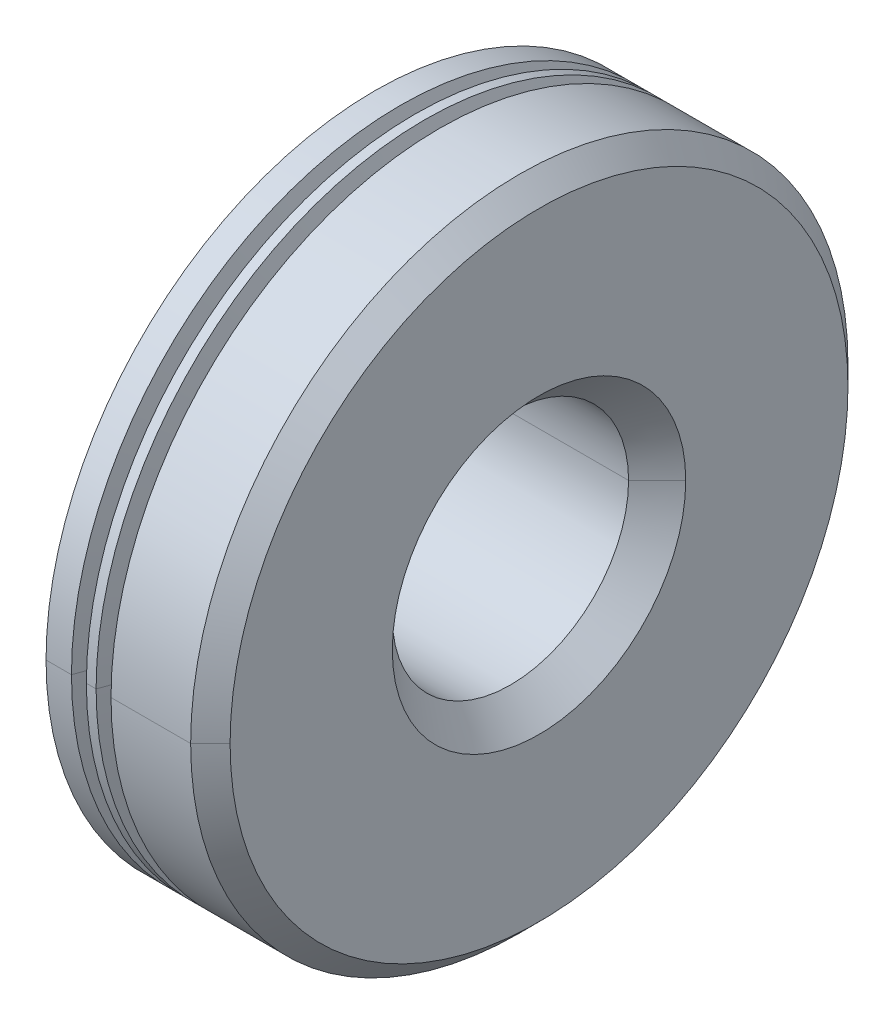
ISO-10303-21;
HEADER;
FILE_DESCRIPTION(('STEP AP214'),'2;1');
FILE_NAME('part.step','',(''),(''),'','','');
FILE_SCHEMA(('AUTOMOTIVE_DESIGN { 1 0 10303 214 1 1 1 1 }'));
ENDSEC;
DATA;
#1=APPLICATION_CONTEXT('core data for automotive mechanical design processes');
#2=APPLICATION_PROTOCOL_DEFINITION('international standard','automotive_design',2000,#1);
#3=PRODUCT_CONTEXT('',#1,'mechanical');
#4=PRODUCT('Part','Part','',(#3));
#5=PRODUCT_RELATED_PRODUCT_CATEGORY('part','',(#4));
#6=PRODUCT_DEFINITION_FORMATION('','',#4);
#7=PRODUCT_DEFINITION_CONTEXT('part definition',#1,'design');
#8=PRODUCT_DEFINITION('design','',#6,#7);
#9=PRODUCT_DEFINITION_SHAPE('','',#8);
#10=(LENGTH_UNIT() NAMED_UNIT(*) SI_UNIT(.MILLI.,.METRE.));
#11=(NAMED_UNIT(*) PLANE_ANGLE_UNIT() SI_UNIT($,.RADIAN.));
#12=(NAMED_UNIT(*) SI_UNIT($,.STERADIAN.) SOLID_ANGLE_UNIT());
#13=UNCERTAINTY_MEASURE_WITH_UNIT(LENGTH_MEASURE(1.E-05),#10,'distance_accuracy_value','');
#14=(GEOMETRIC_REPRESENTATION_CONTEXT(3) GLOBAL_UNCERTAINTY_ASSIGNED_CONTEXT((#13)) GLOBAL_UNIT_ASSIGNED_CONTEXT((#10,
#11,#12)) REPRESENTATION_CONTEXT('',''));
#15=CARTESIAN_POINT('',(0.,0.,0.));
#16=DIRECTION('',(0.,0.,1.));
#17=DIRECTION('',(1.,0.,0.));
#18=AXIS2_PLACEMENT_3D('',#15,#16,#17);
#19=CARTESIAN_POINT('',(1.926,0.,0.));
#20=DIRECTION('',(-1.,0.,0.));
#21=DIRECTION('',(0.,0.,1.));
#22=AXIS2_PLACEMENT_3D('',#19,#20,#21);
#23=CONICAL_SURFACE('',#22,2.716,0.785398163397449);
#24=DIRECTION('',(0.707106781186547,0.,-0.707106781186548));
#25=VECTOR('',#24,1.);
#26=CARTESIAN_POINT('',(1.926,-1.02920078459353E-13,2.716));
#27=LINE('',#26,#25);
#28=CARTESIAN_POINT('',(1.842,0.,2.8));
#29=VERTEX_POINT('',#28);
#30=CARTESIAN_POINT('',(2.01,0.,2.632));
#31=VERTEX_POINT('',#30);
#32=EDGE_CURVE('E27',#29,#31,#27,.T.);
#33=ORIENTED_EDGE('',*,*,#32,.F.);
#34=CARTESIAN_POINT('',(1.842,0.,0.));
#35=DIRECTION('',(1.,0.,0.));
#36=DIRECTION('',(0.,0.,1.));
#37=AXIS2_PLACEMENT_3D('',#34,#35,#36);
#38=CIRCLE('',#37,2.8);
#39=CARTESIAN_POINT('',(1.842,1.06103173669436E-13,-2.8));
#40=VERTEX_POINT('',#39);
#41=EDGE_CURVE('E338',#29,#40,#38,.T.);
#42=ORIENTED_EDGE('',*,*,#41,.T.);
#43=DIRECTION('',(-0.707106781186547,0.,-0.707106781186548));
#44=VECTOR('',#43,1.);
#45=CARTESIAN_POINT('',(1.926,1.02920078459353E-13,-2.716));
#46=LINE('',#45,#44);
#47=CARTESIAN_POINT('',(2.01,0.,-2.632));
#48=VERTEX_POINT('',#47);
#49=EDGE_CURVE('E10',#48,#40,#46,.T.);
#50=ORIENTED_EDGE('',*,*,#49,.F.);
#51=CARTESIAN_POINT('',(2.01,0.,0.));
#52=DIRECTION('',(1.,0.,0.));
#53=DIRECTION('',(0.,0.,1.));
#54=AXIS2_PLACEMENT_3D('',#51,#52,#53);
#55=CIRCLE('',#54,2.632);
#56=EDGE_CURVE('E294',#31,#48,#55,.T.);
#57=ORIENTED_EDGE('',*,*,#56,.F.);
#58=EDGE_LOOP('',(#33,#42,#50,#57));
#59=FACE_BOUND('',#58,.T.);
#60=ADVANCED_FACE('F16',(#59),#23,.T.);
#61=CARTESIAN_POINT('',(1.926,0.,0.));
#62=DIRECTION('',(-1.,0.,0.));
#63=DIRECTION('',(0.,0.,1.));
#64=AXIS2_PLACEMENT_3D('',#61,#62,#63);
#65=CONICAL_SURFACE('',#64,2.716,0.785398163397449);
#66=ORIENTED_EDGE('',*,*,#32,.T.);
#67=CARTESIAN_POINT('',(2.01,0.,0.));
#68=DIRECTION('',(1.,0.,0.));
#69=DIRECTION('',(0.,0.,1.));
#70=AXIS2_PLACEMENT_3D('',#67,#68,#69);
#71=CIRCLE('',#70,2.632);
#72=EDGE_CURVE('E341',#48,#31,#71,.T.);
#73=ORIENTED_EDGE('',*,*,#72,.F.);
#74=ORIENTED_EDGE('',*,*,#49,.T.);
#75=CARTESIAN_POINT('',(1.842,0.,0.));
#76=DIRECTION('',(1.,0.,0.));
#77=DIRECTION('',(0.,0.,1.));
#78=AXIS2_PLACEMENT_3D('',#75,#76,#77);
#79=CIRCLE('',#78,2.8);
#80=EDGE_CURVE('E253',#40,#29,#79,.T.);
#81=ORIENTED_EDGE('',*,*,#80,.T.);
#82=EDGE_LOOP('',(#66,#73,#74,#81));
#83=FACE_BOUND('',#82,.T.);
#84=ADVANCED_FACE('F521',(#83),#65,.T.);
#85=CARTESIAN_POINT('',(1.226,0.,0.));
#86=DIRECTION('',(1.,0.,0.));
#87=DIRECTION('',(0.,0.,1.));
#88=AXIS2_PLACEMENT_3D('',#85,#86,#87);
#89=CYLINDRICAL_SURFACE('',#88,2.8);
#90=DIRECTION('',(1.,0.,0.));
#91=VECTOR('',#90,1.);
#92=CARTESIAN_POINT('',(1.226,-1.06103173669436E-13,2.8));
#93=LINE('',#92,#91);
#94=CARTESIAN_POINT('',(1.1635,0.,2.8));
#95=VERTEX_POINT('',#94);
#96=EDGE_CURVE('E257',#95,#29,#93,.T.);
#97=ORIENTED_EDGE('',*,*,#96,.F.);
#98=CARTESIAN_POINT('',(1.1635,0.,0.));
#99=DIRECTION('',(1.,0.,0.));
#100=DIRECTION('',(0.,0.,1.));
#101=AXIS2_PLACEMENT_3D('',#98,#99,#100);
#102=CIRCLE('',#101,2.8);
#103=CARTESIAN_POINT('',(1.1635,0.,-2.8));
#104=VERTEX_POINT('',#103);
#105=EDGE_CURVE('E240',#95,#104,#102,.T.);
#106=ORIENTED_EDGE('',*,*,#105,.T.);
#107=DIRECTION('',(-1.,0.,0.));
#108=VECTOR('',#107,1.);
#109=CARTESIAN_POINT('',(1.226,1.06103173669436E-13,-2.8));
#110=LINE('',#109,#108);
#111=EDGE_CURVE('E256',#40,#104,#110,.T.);
#112=ORIENTED_EDGE('',*,*,#111,.F.);
#113=ORIENTED_EDGE('',*,*,#41,.F.);
#114=EDGE_LOOP('',(#97,#106,#112,#113));
#115=FACE_BOUND('',#114,.T.);
#116=ADVANCED_FACE('F679',(#115),#89,.T.);
#117=CARTESIAN_POINT('',(2.01,0.,1.316));
#118=DIRECTION('',(1.,0.,0.));
#119=DIRECTION('',(0.,0.,1.));
#120=AXIS2_PLACEMENT_3D('',#117,#118,#119);
#121=PLANE('',#120);
#122=ORIENTED_EDGE('',*,*,#56,.T.);
#123=ORIENTED_EDGE('',*,*,#72,.T.);
#124=EDGE_LOOP('',(#122,#123));
#125=FACE_BOUND('',#124,.T.);
#126=CARTESIAN_POINT('',(2.01,0.,0.));
#127=DIRECTION('',(-1.,0.,0.));
#128=DIRECTION('',(0.,0.,-1.));
#129=AXIS2_PLACEMENT_3D('',#126,#127,#128);
#130=CIRCLE('',#129,1.25);
#131=CARTESIAN_POINT('',(2.01,0.,-1.25));
#132=VERTEX_POINT('',#131);
#133=CARTESIAN_POINT('',(2.01,0.,1.25));
#134=VERTEX_POINT('',#133);
#135=EDGE_CURVE('E271',#132,#134,#130,.T.);
#136=ORIENTED_EDGE('',*,*,#135,.T.);
#137=CARTESIAN_POINT('',(2.01,0.,0.));
#138=DIRECTION('',(-1.,0.,0.));
#139=DIRECTION('',(0.,0.,-1.));
#140=AXIS2_PLACEMENT_3D('',#137,#138,#139);
#141=CIRCLE('',#140,1.25);
#142=EDGE_CURVE('E274',#134,#132,#141,.T.);
#143=ORIENTED_EDGE('',*,*,#142,.T.);
#144=EDGE_LOOP('',(#136,#143));
#145=FACE_BOUND('',#144,.T.);
#146=ADVANCED_FACE('F657',(#125,#145),#121,.T.);
#147=CARTESIAN_POINT('',(1.226,0.,0.));
#148=DIRECTION('',(1.,0.,0.));
#149=DIRECTION('',(0.,0.,1.));
#150=AXIS2_PLACEMENT_3D('',#147,#148,#149);
#151=CYLINDRICAL_SURFACE('',#150,2.8);
#152=ORIENTED_EDGE('',*,*,#96,.T.);
#153=ORIENTED_EDGE('',*,*,#80,.F.);
#154=ORIENTED_EDGE('',*,*,#111,.T.);
#155=CARTESIAN_POINT('',(1.1635,0.,0.));
#156=DIRECTION('',(1.,0.,0.));
#157=DIRECTION('',(0.,0.,1.));
#158=AXIS2_PLACEMENT_3D('',#155,#156,#157);
#159=CIRCLE('',#158,2.8);
#160=EDGE_CURVE('E307',#104,#95,#159,.T.);
#161=ORIENTED_EDGE('',*,*,#160,.T.);
#162=EDGE_LOOP('',(#152,#153,#154,#161));
#163=FACE_BOUND('',#162,.T.);
#164=ADVANCED_FACE('F652',(#163),#151,.T.);
#165=CARTESIAN_POINT('',(1.1403878901241,0.,0.));
#166=DIRECTION('',(1.,0.,0.));
#167=DIRECTION('',(0.,0.,-1.));
#168=AXIS2_PLACEMENT_3D('',#165,#166,#167);
#169=CONICAL_SURFACE('',#168,2.7365,1.22173047639603);
#170=DIRECTION('',(0.342020143325669,0.,-0.939692620785908));
#171=VECTOR('',#170,1.);
#172=CARTESIAN_POINT('',(1.1403878901241,0.,-2.7365));
#173=LINE('',#172,#171);
#174=CARTESIAN_POINT('',(1.11727578024819,0.,-2.673));
#175=VERTEX_POINT('',#174);
#176=EDGE_CURVE('E281',#175,#104,#173,.T.);
#177=ORIENTED_EDGE('',*,*,#176,.T.);
#178=ORIENTED_EDGE('',*,*,#105,.F.);
#179=DIRECTION('',(-0.342020143325669,0.,-0.939692620785908));
#180=VECTOR('',#179,1.);
#181=CARTESIAN_POINT('',(1.1403878901241,0.,2.7365));
#182=LINE('',#181,#180);
#183=CARTESIAN_POINT('',(1.11727578024819,0.,2.673));
#184=VERTEX_POINT('',#183);
#185=EDGE_CURVE('E285',#95,#184,#182,.T.);
#186=ORIENTED_EDGE('',*,*,#185,.T.);
#187=CARTESIAN_POINT('',(1.11727578024819,0.,0.));
#188=DIRECTION('',(-1.,0.,0.));
#189=DIRECTION('',(0.,0.,-1.));
#190=AXIS2_PLACEMENT_3D('',#187,#188,#189);
#191=CIRCLE('',#190,2.673);
#192=EDGE_CURVE('E286',#175,#184,#191,.T.);
#193=ORIENTED_EDGE('',*,*,#192,.F.);
#194=EDGE_LOOP('',(#177,#178,#186,#193));
#195=FACE_BOUND('',#194,.T.);
#196=ADVANCED_FACE('F447',(#195),#169,.T.);
#197=CARTESIAN_POINT('',(1.88825,0.,0.));
#198=DIRECTION('',(1.,0.,0.));
#199=DIRECTION('',(0.,0.,1.));
#200=AXIS2_PLACEMENT_3D('',#197,#198,#199);
#201=CONICAL_SURFACE('',#200,1.12825,0.785398163397448);
#202=DIRECTION('',(-0.707106781186548,0.,-0.707106781186548));
#203=VECTOR('',#202,1.);
#204=CARTESIAN_POINT('',(1.88825,0.,1.12825));
#205=LINE('',#204,#203);
#206=CARTESIAN_POINT('',(1.7665,0.,1.0065));
#207=VERTEX_POINT('',#206);
#208=EDGE_CURVE('E303',#134,#207,#205,.T.);
#209=ORIENTED_EDGE('',*,*,#208,.F.);
#210=ORIENTED_EDGE('',*,*,#135,.F.);
#211=DIRECTION('',(0.707106781186548,0.,-0.707106781186548));
#212=VECTOR('',#211,1.);
#213=CARTESIAN_POINT('',(1.88825,0.,-1.12825));
#214=LINE('',#213,#212);
#215=CARTESIAN_POINT('',(1.7665,0.,-1.0065));
#216=VERTEX_POINT('',#215);
#217=EDGE_CURVE('E306',#216,#132,#214,.T.);
#218=ORIENTED_EDGE('',*,*,#217,.F.);
#219=CARTESIAN_POINT('',(1.7665,0.,0.));
#220=DIRECTION('',(-1.,0.,0.));
#221=DIRECTION('',(0.,0.,1.));
#222=AXIS2_PLACEMENT_3D('',#219,#220,#221);
#223=CIRCLE('',#222,1.0065);
#224=EDGE_CURVE('E349',#216,#207,#223,.T.);
#225=ORIENTED_EDGE('',*,*,#224,.T.);
#226=EDGE_LOOP('',(#209,#210,#218,#225));
#227=FACE_BOUND('',#226,.T.);
#228=ADVANCED_FACE('F558',(#227),#201,.F.);
#229=CARTESIAN_POINT('',(1.88825,0.,0.));
#230=DIRECTION('',(1.,0.,0.));
#231=DIRECTION('',(0.,0.,1.));
#232=AXIS2_PLACEMENT_3D('',#229,#230,#231);
#233=CONICAL_SURFACE('',#232,1.12825,0.785398163397448);
#234=ORIENTED_EDGE('',*,*,#208,.T.);
#235=CARTESIAN_POINT('',(1.7665,0.,0.));
#236=DIRECTION('',(-1.,0.,0.));
#237=DIRECTION('',(0.,0.,1.));
#238=AXIS2_PLACEMENT_3D('',#235,#236,#237);
#239=CIRCLE('',#238,1.0065);
#240=EDGE_CURVE('E312',#207,#216,#239,.T.);
#241=ORIENTED_EDGE('',*,*,#240,.T.);
#242=ORIENTED_EDGE('',*,*,#217,.T.);
#243=ORIENTED_EDGE('',*,*,#142,.F.);
#244=EDGE_LOOP('',(#234,#241,#242,#243));
#245=FACE_BOUND('',#244,.T.);
#246=ADVANCED_FACE('F553',(#245),#233,.F.);
#247=CARTESIAN_POINT('',(1.1403878901241,0.,0.));
#248=DIRECTION('',(1.,0.,0.));
#249=DIRECTION('',(0.,0.,-1.));
#250=AXIS2_PLACEMENT_3D('',#247,#248,#249);
#251=CONICAL_SURFACE('',#250,2.7365,1.22173047639603);
#252=ORIENTED_EDGE('',*,*,#176,.F.);
#253=CARTESIAN_POINT('',(1.11727578024819,0.,0.));
#254=DIRECTION('',(-1.,0.,0.));
#255=DIRECTION('',(0.,0.,-1.));
#256=AXIS2_PLACEMENT_3D('',#253,#254,#255);
#257=CIRCLE('',#256,2.673);
#258=EDGE_CURVE('E342',#184,#175,#257,.T.);
#259=ORIENTED_EDGE('',*,*,#258,.F.);
#260=ORIENTED_EDGE('',*,*,#185,.F.);
#261=ORIENTED_EDGE('',*,*,#160,.F.);
#262=EDGE_LOOP('',(#252,#259,#260,#261));
#263=FACE_BOUND('',#262,.T.);
#264=ADVANCED_FACE('F455',(#263),#251,.T.);
#265=CARTESIAN_POINT('',(1.1,0.,0.));
#266=DIRECTION('',(-1.,0.,0.));
#267=DIRECTION('',(0.,0.,-1.));
#268=AXIS2_PLACEMENT_3D('',#265,#266,#267);
#269=CYLINDRICAL_SURFACE('',#268,2.673);
#270=DIRECTION('',(1.,0.,0.));
#271=VECTOR('',#270,1.);
#272=CARTESIAN_POINT('',(1.1,0.,-2.673));
#273=LINE('',#272,#271);
#274=CARTESIAN_POINT('',(1.08272421975181,0.,-2.673));
#275=VERTEX_POINT('',#274);
#276=EDGE_CURVE('E116',#275,#175,#273,.T.);
#277=ORIENTED_EDGE('',*,*,#276,.T.);
#278=ORIENTED_EDGE('',*,*,#192,.T.);
#279=DIRECTION('',(-1.,0.,0.));
#280=VECTOR('',#279,1.);
#281=CARTESIAN_POINT('',(1.1,0.,2.673));
#282=LINE('',#281,#280);
#283=CARTESIAN_POINT('',(1.08272421975181,0.,2.673));
#284=VERTEX_POINT('',#283);
#285=EDGE_CURVE('E128',#184,#284,#282,.T.);
#286=ORIENTED_EDGE('',*,*,#285,.T.);
#287=CARTESIAN_POINT('',(1.08272421975181,0.,0.));
#288=DIRECTION('',(-1.,0.,0.));
#289=DIRECTION('',(0.,0.,-1.));
#290=AXIS2_PLACEMENT_3D('',#287,#288,#289);
#291=CIRCLE('',#290,2.673);
#292=EDGE_CURVE('E270',#275,#284,#291,.T.);
#293=ORIENTED_EDGE('',*,*,#292,.F.);
#294=EDGE_LOOP('',(#277,#278,#286,#293));
#295=FACE_BOUND('',#294,.T.);
#296=ADVANCED_FACE('F454',(#295),#269,.T.);
#297=CARTESIAN_POINT('',(1.005,0.,0.));
#298=DIRECTION('',(-1.,0.,0.));
#299=DIRECTION('',(0.,0.,1.));
#300=AXIS2_PLACEMENT_3D('',#297,#298,#299);
#301=CYLINDRICAL_SURFACE('',#300,1.0065);
#302=DIRECTION('',(-1.,0.,0.));
#303=VECTOR('',#302,1.);
#304=CARTESIAN_POINT('',(1.005,0.,1.0065));
#305=LINE('',#304,#303);
#306=CARTESIAN_POINT('',(0.2435,0.,1.0065));
#307=VERTEX_POINT('',#306);
#308=EDGE_CURVE('E313',#207,#307,#305,.T.);
#309=ORIENTED_EDGE('',*,*,#308,.F.);
#310=ORIENTED_EDGE('',*,*,#224,.F.);
#311=DIRECTION('',(1.,0.,0.));
#312=VECTOR('',#311,1.);
#313=CARTESIAN_POINT('',(1.005,0.,-1.0065));
#314=LINE('',#313,#312);
#315=CARTESIAN_POINT('',(0.2435,0.,-1.0065));
#316=VERTEX_POINT('',#315);
#317=EDGE_CURVE('E308',#316,#216,#314,.T.);
#318=ORIENTED_EDGE('',*,*,#317,.F.);
#319=CARTESIAN_POINT('',(0.2435,0.,0.));
#320=DIRECTION('',(-1.,0.,0.));
#321=DIRECTION('',(0.,0.,1.));
#322=AXIS2_PLACEMENT_3D('',#319,#320,#321);
#323=CIRCLE('',#322,1.0065);
#324=EDGE_CURVE('E279',#316,#307,#323,.T.);
#325=ORIENTED_EDGE('',*,*,#324,.T.);
#326=EDGE_LOOP('',(#309,#310,#318,#325));
#327=FACE_BOUND('',#326,.T.);
#328=ADVANCED_FACE('F616',(#327),#301,.F.);
#329=CARTESIAN_POINT('',(1.005,0.,0.));
#330=DIRECTION('',(-1.,0.,0.));
#331=DIRECTION('',(0.,0.,1.));
#332=AXIS2_PLACEMENT_3D('',#329,#330,#331);
#333=CYLINDRICAL_SURFACE('',#332,1.0065);
#334=ORIENTED_EDGE('',*,*,#308,.T.);
#335=CARTESIAN_POINT('',(0.2435,0.,0.));
#336=DIRECTION('',(-1.,0.,0.));
#337=DIRECTION('',(0.,0.,1.));
#338=AXIS2_PLACEMENT_3D('',#335,#336,#337);
#339=CIRCLE('',#338,1.0065);
#340=EDGE_CURVE('E275',#307,#316,#339,.T.);
#341=ORIENTED_EDGE('',*,*,#340,.T.);
#342=ORIENTED_EDGE('',*,*,#317,.T.);
#343=ORIENTED_EDGE('',*,*,#240,.F.);
#344=EDGE_LOOP('',(#334,#341,#342,#343));
#345=FACE_BOUND('',#344,.T.);
#346=ADVANCED_FACE('F584',(#345),#333,.F.);
#347=CARTESIAN_POINT('',(1.1,0.,0.));
#348=DIRECTION('',(-1.,0.,0.));
#349=DIRECTION('',(0.,0.,-1.));
#350=AXIS2_PLACEMENT_3D('',#347,#348,#349);
#351=CYLINDRICAL_SURFACE('',#350,2.673);
#352=ORIENTED_EDGE('',*,*,#276,.F.);
#353=CARTESIAN_POINT('',(1.08272421975181,0.,0.));
#354=DIRECTION('',(-1.,0.,0.));
#355=DIRECTION('',(0.,0.,-1.));
#356=AXIS2_PLACEMENT_3D('',#353,#354,#355);
#357=CIRCLE('',#356,2.673);
#358=EDGE_CURVE('E320',#284,#275,#357,.T.);
#359=ORIENTED_EDGE('',*,*,#358,.F.);
#360=ORIENTED_EDGE('',*,*,#285,.F.);
#361=ORIENTED_EDGE('',*,*,#258,.T.);
#362=EDGE_LOOP('',(#352,#359,#360,#361));
#363=FACE_BOUND('',#362,.T.);
#364=ADVANCED_FACE('F456',(#363),#351,.T.);
#365=CARTESIAN_POINT('',(1.0596121098759,0.,0.));
#366=DIRECTION('',(-1.,0.,0.));
#367=DIRECTION('',(0.,0.,-1.));
#368=AXIS2_PLACEMENT_3D('',#365,#366,#367);
#369=CONICAL_SURFACE('',#368,2.7365,1.22173047639603);
#370=DIRECTION('',(0.342020143325669,0.,0.939692620785908));
#371=VECTOR('',#370,1.);
#372=CARTESIAN_POINT('',(1.0596121098759,0.,-2.7365));
#373=LINE('',#372,#371);
#374=CARTESIAN_POINT('',(1.0365,0.,-2.8));
#375=VERTEX_POINT('',#374);
#376=EDGE_CURVE('E321',#375,#275,#373,.T.);
#377=ORIENTED_EDGE('',*,*,#376,.T.);
#378=ORIENTED_EDGE('',*,*,#292,.T.);
#379=DIRECTION('',(-0.342020143325669,0.,0.939692620785908));
#380=VECTOR('',#379,1.);
#381=CARTESIAN_POINT('',(1.0596121098759,0.,2.7365));
#382=LINE('',#381,#380);
#383=CARTESIAN_POINT('',(1.0365,0.,2.8));
#384=VERTEX_POINT('',#383);
#385=EDGE_CURVE('E317',#284,#384,#382,.T.);
#386=ORIENTED_EDGE('',*,*,#385,.T.);
#387=CARTESIAN_POINT('',(1.0365,0.,0.));
#388=DIRECTION('',(-1.,0.,0.));
#389=DIRECTION('',(0.,0.,1.));
#390=AXIS2_PLACEMENT_3D('',#387,#388,#389);
#391=CIRCLE('',#390,2.8);
#392=EDGE_CURVE('E333',#375,#384,#391,.T.);
#393=ORIENTED_EDGE('',*,*,#392,.F.);
#394=EDGE_LOOP('',(#377,#378,#386,#393));
#395=FACE_BOUND('',#394,.T.);
#396=ADVANCED_FACE('F468',(#395),#369,.T.);
#397=CARTESIAN_POINT('',(0.12175,0.,0.));
#398=DIRECTION('',(-1.,0.,0.));
#399=DIRECTION('',(0.,0.,1.));
#400=AXIS2_PLACEMENT_3D('',#397,#398,#399);
#401=CONICAL_SURFACE('',#400,1.12825,0.785398163397448);
#402=DIRECTION('',(-0.707106781186548,0.,0.707106781186548));
#403=VECTOR('',#402,1.);
#404=CARTESIAN_POINT('',(0.12175,0.,1.12825));
#405=LINE('',#404,#403);
#406=CARTESIAN_POINT('',(0.,0.,1.25));
#407=VERTEX_POINT('',#406);
#408=EDGE_CURVE('E105',#307,#407,#405,.T.);
#409=ORIENTED_EDGE('',*,*,#408,.F.);
#410=ORIENTED_EDGE('',*,*,#324,.F.);
#411=DIRECTION('',(0.707106781186548,0.,0.707106781186548));
#412=VECTOR('',#411,1.);
#413=CARTESIAN_POINT('',(0.12175,0.,-1.12825));
#414=LINE('',#413,#412);
#415=CARTESIAN_POINT('',(0.,0.,-1.25));
#416=VERTEX_POINT('',#415);
#417=EDGE_CURVE('E280',#416,#316,#414,.T.);
#418=ORIENTED_EDGE('',*,*,#417,.F.);
#419=CARTESIAN_POINT('',(0.,0.,0.));
#420=DIRECTION('',(1.,0.,0.));
#421=DIRECTION('',(0.,0.,-1.));
#422=AXIS2_PLACEMENT_3D('',#419,#420,#421);
#423=CIRCLE('',#422,1.25);
#424=EDGE_CURVE('E337',#407,#416,#423,.T.);
#425=ORIENTED_EDGE('',*,*,#424,.F.);
#426=EDGE_LOOP('',(#409,#410,#418,#425));
#427=FACE_BOUND('',#426,.T.);
#428=ADVANCED_FACE('F572',(#427),#401,.F.);
#429=CARTESIAN_POINT('',(0.12175,0.,0.));
#430=DIRECTION('',(-1.,0.,0.));
#431=DIRECTION('',(0.,0.,1.));
#432=AXIS2_PLACEMENT_3D('',#429,#430,#431);
#433=CONICAL_SURFACE('',#432,1.12825,0.785398163397448);
#434=ORIENTED_EDGE('',*,*,#408,.T.);
#435=CARTESIAN_POINT('',(0.,0.,0.));
#436=DIRECTION('',(1.,0.,0.));
#437=DIRECTION('',(0.,0.,-1.));
#438=AXIS2_PLACEMENT_3D('',#435,#436,#437);
#439=CIRCLE('',#438,1.25);
#440=EDGE_CURVE('E396',#416,#407,#439,.T.);
#441=ORIENTED_EDGE('',*,*,#440,.F.);
#442=ORIENTED_EDGE('',*,*,#417,.T.);
#443=ORIENTED_EDGE('',*,*,#340,.F.);
#444=EDGE_LOOP('',(#434,#441,#442,#443));
#445=FACE_BOUND('',#444,.T.);
#446=ADVANCED_FACE('F604',(#445),#433,.F.);
#447=CARTESIAN_POINT('',(1.0596121098759,0.,0.));
#448=DIRECTION('',(-1.,0.,0.));
#449=DIRECTION('',(0.,0.,-1.));
#450=AXIS2_PLACEMENT_3D('',#447,#448,#449);
#451=CONICAL_SURFACE('',#450,2.7365,1.22173047639603);
#452=ORIENTED_EDGE('',*,*,#376,.F.);
#453=CARTESIAN_POINT('',(1.0365,0.,0.));
#454=DIRECTION('',(-1.,0.,0.));
#455=DIRECTION('',(0.,0.,1.));
#456=AXIS2_PLACEMENT_3D('',#453,#454,#455);
#457=CIRCLE('',#456,2.8);
#458=EDGE_CURVE('E20',#384,#375,#457,.T.);
#459=ORIENTED_EDGE('',*,*,#458,.F.);
#460=ORIENTED_EDGE('',*,*,#385,.F.);
#461=ORIENTED_EDGE('',*,*,#358,.T.);
#462=EDGE_LOOP('',(#452,#459,#460,#461));
#463=FACE_BOUND('',#462,.T.);
#464=ADVANCED_FACE('F464',(#463),#451,.T.);
#465=CARTESIAN_POINT('',(1.226,0.,0.));
#466=DIRECTION('',(1.,0.,0.));
#467=DIRECTION('',(0.,0.,1.));
#468=AXIS2_PLACEMENT_3D('',#465,#466,#467);
#469=CYLINDRICAL_SURFACE('',#468,2.8);
#470=DIRECTION('',(1.,0.,0.));
#471=VECTOR('',#470,1.);
#472=CARTESIAN_POINT('',(1.226,-1.06103173669436E-13,2.8));
#473=LINE('',#472,#471);
#474=CARTESIAN_POINT('',(0.9535,0.,2.8));
#475=VERTEX_POINT('',#474);
#476=EDGE_CURVE('E299',#475,#384,#473,.T.);
#477=ORIENTED_EDGE('',*,*,#476,.F.);
#478=CARTESIAN_POINT('',(0.9535,0.,0.));
#479=DIRECTION('',(1.,0.,0.));
#480=DIRECTION('',(0.,0.,1.));
#481=AXIS2_PLACEMENT_3D('',#478,#479,#480);
#482=CIRCLE('',#481,2.8);
#483=CARTESIAN_POINT('',(0.9535,0.,-2.8));
#484=VERTEX_POINT('',#483);
#485=EDGE_CURVE('E295',#475,#484,#482,.T.);
#486=ORIENTED_EDGE('',*,*,#485,.T.);
#487=DIRECTION('',(-1.,0.,0.));
#488=VECTOR('',#487,1.);
#489=CARTESIAN_POINT('',(1.226,1.06103173669436E-13,-2.8));
#490=LINE('',#489,#488);
#491=EDGE_CURVE('E400',#375,#484,#490,.T.);
#492=ORIENTED_EDGE('',*,*,#491,.F.);
#493=ORIENTED_EDGE('',*,*,#392,.T.);
#494=EDGE_LOOP('',(#477,#486,#492,#493));
#495=FACE_BOUND('',#494,.T.);
#496=ADVANCED_FACE('F471',(#495),#469,.T.);
#497=CARTESIAN_POINT('',(0.,0.,0.9475));
#498=DIRECTION('',(-1.,0.,0.));
#499=DIRECTION('',(0.,0.,1.));
#500=AXIS2_PLACEMENT_3D('',#497,#498,#499);
#501=PLANE('',#500);
#502=CARTESIAN_POINT('',(0.,0.,0.));
#503=DIRECTION('',(1.,0.,0.));
#504=DIRECTION('',(0.,0.,1.));
#505=AXIS2_PLACEMENT_3D('',#502,#503,#504);
#506=CIRCLE('',#505,1.895);
#507=CARTESIAN_POINT('',(0.,0.,1.895));
#508=VERTEX_POINT('',#507);
#509=CARTESIAN_POINT('',(0.,0.,-1.895));
#510=VERTEX_POINT('',#509);
#511=EDGE_CURVE('E300',#508,#510,#506,.T.);
#512=ORIENTED_EDGE('',*,*,#511,.F.);
#513=CARTESIAN_POINT('',(0.,0.,0.));
#514=DIRECTION('',(1.,0.,0.));
#515=DIRECTION('',(0.,0.,1.));
#516=AXIS2_PLACEMENT_3D('',#513,#514,#515);
#517=CIRCLE('',#516,1.895);
#518=EDGE_CURVE('E360',#510,#508,#517,.T.);
#519=ORIENTED_EDGE('',*,*,#518,.F.);
#520=EDGE_LOOP('',(#512,#519));
#521=FACE_BOUND('',#520,.T.);
#522=ORIENTED_EDGE('',*,*,#440,.T.);
#523=ORIENTED_EDGE('',*,*,#424,.T.);
#524=EDGE_LOOP('',(#522,#523));
#525=FACE_BOUND('',#524,.T.);
#526=ADVANCED_FACE('F717',(#521,#525),#501,.T.);
#527=CARTESIAN_POINT('',(1.226,0.,0.));
#528=DIRECTION('',(1.,0.,0.));
#529=DIRECTION('',(0.,0.,1.));
#530=AXIS2_PLACEMENT_3D('',#527,#528,#529);
#531=CYLINDRICAL_SURFACE('',#530,2.8);
#532=ORIENTED_EDGE('',*,*,#476,.T.);
#533=ORIENTED_EDGE('',*,*,#458,.T.);
#534=ORIENTED_EDGE('',*,*,#491,.T.);
#535=CARTESIAN_POINT('',(0.9535,0.,0.));
#536=DIRECTION('',(1.,0.,0.));
#537=DIRECTION('',(0.,0.,1.));
#538=AXIS2_PLACEMENT_3D('',#535,#536,#537);
#539=CIRCLE('',#538,2.8);
#540=EDGE_CURVE('E251',#484,#475,#539,.T.);
#541=ORIENTED_EDGE('',*,*,#540,.T.);
#542=EDGE_LOOP('',(#532,#533,#534,#541));
#543=FACE_BOUND('',#542,.T.);
#544=ADVANCED_FACE('F476',(#543),#531,.T.);
#545=CARTESIAN_POINT('',(0.930387890124096,0.,0.));
#546=DIRECTION('',(1.,0.,0.));
#547=DIRECTION('',(0.,0.,-1.));
#548=AXIS2_PLACEMENT_3D('',#545,#546,#547);
#549=CONICAL_SURFACE('',#548,2.7365,1.22173047639603);
#550=DIRECTION('',(0.342020143325669,0.,-0.939692620785908));
#551=VECTOR('',#550,1.);
#552=CARTESIAN_POINT('',(0.930387890124096,0.,-2.7365));
#553=LINE('',#552,#551);
#554=CARTESIAN_POINT('',(0.907275780248193,0.,-2.673));
#555=VERTEX_POINT('',#554);
#556=EDGE_CURVE('E252',#555,#484,#553,.T.);
#557=ORIENTED_EDGE('',*,*,#556,.T.);
#558=ORIENTED_EDGE('',*,*,#485,.F.);
#559=DIRECTION('',(-0.342020143325669,0.,-0.939692620785908));
#560=VECTOR('',#559,1.);
#561=CARTESIAN_POINT('',(0.930387890124096,0.,2.7365));
#562=LINE('',#561,#560);
#563=CARTESIAN_POINT('',(0.907275780248192,0.,2.673));
#564=VERTEX_POINT('',#563);
#565=EDGE_CURVE('E247',#475,#564,#562,.T.);
#566=ORIENTED_EDGE('',*,*,#565,.T.);
#567=CARTESIAN_POINT('',(0.907275780248192,0.,0.));
#568=DIRECTION('',(-1.,0.,0.));
#569=DIRECTION('',(0.,0.,-1.));
#570=AXIS2_PLACEMENT_3D('',#567,#568,#569);
#571=CIRCLE('',#570,2.673);
#572=EDGE_CURVE('E395',#555,#564,#571,.T.);
#573=ORIENTED_EDGE('',*,*,#572,.F.);
#574=EDGE_LOOP('',(#557,#558,#566,#573));
#575=FACE_BOUND('',#574,.T.);
#576=ADVANCED_FACE('F756',(#575),#549,.T.);
#577=CARTESIAN_POINT('',(0.0703846153846154,0.,0.));
#578=DIRECTION('',(1.,0.,0.));
#579=DIRECTION('',(0.,0.,1.));
#580=AXIS2_PLACEMENT_3D('',#577,#578,#579);
#581=CYLINDRICAL_SURFACE('',#580,1.895);
#582=DIRECTION('',(1.,0.,0.));
#583=VECTOR('',#582,1.);
#584=CARTESIAN_POINT('',(0.070384615384615,0.,1.895));
#585=LINE('',#584,#583);
#586=CARTESIAN_POINT('',(0.14076923076923,0.,1.895));
#587=VERTEX_POINT('',#586);
#588=EDGE_CURVE('E407',#508,#587,#585,.T.);
#589=ORIENTED_EDGE('',*,*,#588,.F.);
#590=ORIENTED_EDGE('',*,*,#511,.T.);
#591=DIRECTION('',(-1.,0.,0.));
#592=VECTOR('',#591,1.);
#593=CARTESIAN_POINT('',(0.0703846153846157,0.,-1.895));
#594=LINE('',#593,#592);
#595=CARTESIAN_POINT('',(0.140769230769231,0.,-1.895));
#596=VERTEX_POINT('',#595);
#597=EDGE_CURVE('E388',#596,#510,#594,.T.);
#598=ORIENTED_EDGE('',*,*,#597,.F.);
#599=CARTESIAN_POINT('',(0.140769230769231,0.,0.));
#600=DIRECTION('',(1.,0.,0.));
#601=DIRECTION('',(0.,0.,1.));
#602=AXIS2_PLACEMENT_3D('',#599,#600,#601);
#603=CIRCLE('',#602,1.895);
#604=EDGE_CURVE('E290',#587,#596,#603,.T.);
#605=ORIENTED_EDGE('',*,*,#604,.F.);
#606=EDGE_LOOP('',(#589,#590,#598,#605));
#607=FACE_BOUND('',#606,.T.);
#608=ADVANCED_FACE('F595',(#607),#581,.T.);
#609=CARTESIAN_POINT('',(0.0703846153846154,0.,0.));
#610=DIRECTION('',(1.,0.,0.));
#611=DIRECTION('',(0.,0.,1.));
#612=AXIS2_PLACEMENT_3D('',#609,#610,#611);
#613=CYLINDRICAL_SURFACE('',#612,1.895);
#614=ORIENTED_EDGE('',*,*,#588,.T.);
#615=CARTESIAN_POINT('',(0.140769230769231,0.,0.));
#616=DIRECTION('',(1.,0.,0.));
#617=DIRECTION('',(0.,0.,1.));
#618=AXIS2_PLACEMENT_3D('',#615,#616,#617);
#619=CIRCLE('',#618,1.895);
#620=EDGE_CURVE('E245',#596,#587,#619,.T.);
#621=ORIENTED_EDGE('',*,*,#620,.F.);
#622=ORIENTED_EDGE('',*,*,#597,.T.);
#623=ORIENTED_EDGE('',*,*,#518,.T.);
#624=EDGE_LOOP('',(#614,#621,#622,#623));
#625=FACE_BOUND('',#624,.T.);
#626=ADVANCED_FACE('F544',(#625),#613,.T.);
#627=CARTESIAN_POINT('',(0.930387890124096,0.,0.));
#628=DIRECTION('',(1.,0.,0.));
#629=DIRECTION('',(0.,0.,-1.));
#630=AXIS2_PLACEMENT_3D('',#627,#628,#629);
#631=CONICAL_SURFACE('',#630,2.7365,1.22173047639603);
#632=ORIENTED_EDGE('',*,*,#556,.F.);
#633=CARTESIAN_POINT('',(0.907275780248192,0.,0.));
#634=DIRECTION('',(-1.,0.,0.));
#635=DIRECTION('',(0.,0.,-1.));
#636=AXIS2_PLACEMENT_3D('',#633,#634,#635);
#637=CIRCLE('',#636,2.673);
#638=EDGE_CURVE('E325',#564,#555,#637,.T.);
#639=ORIENTED_EDGE('',*,*,#638,.F.);
#640=ORIENTED_EDGE('',*,*,#565,.F.);
#641=ORIENTED_EDGE('',*,*,#540,.F.);
#642=EDGE_LOOP('',(#632,#639,#640,#641));
#643=FACE_BOUND('',#642,.T.);
#644=ADVANCED_FACE('F491',(#643),#631,.T.);
#645=CARTESIAN_POINT('',(0.89,0.,0.));
#646=DIRECTION('',(-1.,0.,0.));
#647=DIRECTION('',(0.,0.,-1.));
#648=AXIS2_PLACEMENT_3D('',#645,#646,#647);
#649=CYLINDRICAL_SURFACE('',#648,2.673);
#650=DIRECTION('',(1.,0.,0.));
#651=VECTOR('',#650,1.);
#652=CARTESIAN_POINT('',(0.89,0.,-2.673));
#653=LINE('',#652,#651);
#654=CARTESIAN_POINT('',(0.872724219751808,0.,-2.673));
#655=VERTEX_POINT('',#654);
#656=EDGE_CURVE('E326',#655,#555,#653,.T.);
#657=ORIENTED_EDGE('',*,*,#656,.T.);
#658=ORIENTED_EDGE('',*,*,#572,.T.);
#659=DIRECTION('',(-1.,0.,0.));
#660=VECTOR('',#659,1.);
#661=CARTESIAN_POINT('',(0.89,0.,2.673));
#662=LINE('',#661,#660);
#663=CARTESIAN_POINT('',(0.872724219751807,0.,2.673));
#664=VERTEX_POINT('',#663);
#665=EDGE_CURVE('E322',#564,#664,#662,.T.);
#666=ORIENTED_EDGE('',*,*,#665,.T.);
#667=CARTESIAN_POINT('',(0.872724219751808,0.,0.));
#668=DIRECTION('',(-1.,0.,0.));
#669=DIRECTION('',(0.,0.,-1.));
#670=AXIS2_PLACEMENT_3D('',#667,#668,#669);
#671=CIRCLE('',#670,2.673);
#672=EDGE_CURVE('E200',#655,#664,#671,.T.);
#673=ORIENTED_EDGE('',*,*,#672,.F.);
#674=EDGE_LOOP('',(#657,#658,#666,#673));
#675=FACE_BOUND('',#674,.T.);
#676=ADVANCED_FACE('F485',(#675),#649,.T.);
#677=CARTESIAN_POINT('',(0.375384615384615,0.,0.));
#678=DIRECTION('',(-1.,0.,0.));
#679=DIRECTION('',(0.,0.,1.));
#680=AXIS2_PLACEMENT_3D('',#677,#678,#679);
#681=CONICAL_SURFACE('',#680,1.84988095238095,0.189991183301304);
#682=DIRECTION('',(0.982005900191076,0.,-0.188850236933701));
#683=VECTOR('',#682,1.);
#684=CARTESIAN_POINT('',(0.375384615384615,0.,1.84988095238095));
#685=LINE('',#684,#683);
#686=CARTESIAN_POINT('',(0.305,0.,1.86341666666667));
#687=VERTEX_POINT('',#686);
#688=EDGE_CURVE('E246',#587,#687,#685,.T.);
#689=ORIENTED_EDGE('',*,*,#688,.F.);
#690=ORIENTED_EDGE('',*,*,#604,.T.);
#691=DIRECTION('',(-0.982005900191075,0.,-0.188850236933702));
#692=VECTOR('',#691,1.);
#693=CARTESIAN_POINT('',(0.375384615384616,0.,-1.84988095238095));
#694=LINE('',#693,#692);
#695=CARTESIAN_POINT('',(0.305,0.,-1.86341666666667));
#696=VERTEX_POINT('',#695);
#697=EDGE_CURVE('E242',#696,#596,#694,.T.);
#698=ORIENTED_EDGE('',*,*,#697,.F.);
#699=CARTESIAN_POINT('',(0.305,0.,0.));
#700=DIRECTION('',(1.,0.,0.));
#701=DIRECTION('',(0.,0.,1.));
#702=AXIS2_PLACEMENT_3D('',#699,#700,#701);
#703=CIRCLE('',#702,1.86341666666667);
#704=EDGE_CURVE('E376',#687,#696,#703,.T.);
#705=ORIENTED_EDGE('',*,*,#704,.F.);
#706=EDGE_LOOP('',(#689,#690,#698,#705));
#707=FACE_BOUND('',#706,.T.);
#708=ADVANCED_FACE('F490',(#707),#681,.T.);
#709=CARTESIAN_POINT('',(0.375384615384615,0.,0.));
#710=DIRECTION('',(-1.,0.,0.));
#711=DIRECTION('',(0.,0.,1.));
#712=AXIS2_PLACEMENT_3D('',#709,#710,#711);
#713=CONICAL_SURFACE('',#712,1.84988095238095,0.189991183301304);
#714=ORIENTED_EDGE('',*,*,#688,.T.);
#715=CARTESIAN_POINT('',(0.305,0.,0.));
#716=DIRECTION('',(1.,0.,0.));
#717=DIRECTION('',(0.,0.,1.));
#718=AXIS2_PLACEMENT_3D('',#715,#716,#717);
#719=CIRCLE('',#718,1.86341666666667);
#720=EDGE_CURVE('E369',#696,#687,#719,.T.);
#721=ORIENTED_EDGE('',*,*,#720,.F.);
#722=ORIENTED_EDGE('',*,*,#697,.T.);
#723=ORIENTED_EDGE('',*,*,#620,.T.);
#724=EDGE_LOOP('',(#714,#721,#722,#723));
#725=FACE_BOUND('',#724,.T.);
#726=ADVANCED_FACE('F768',(#725),#713,.T.);
#727=CARTESIAN_POINT('',(0.89,0.,0.));
#728=DIRECTION('',(-1.,0.,0.));
#729=DIRECTION('',(0.,0.,-1.));
#730=AXIS2_PLACEMENT_3D('',#727,#728,#729);
#731=CYLINDRICAL_SURFACE('',#730,2.673);
#732=ORIENTED_EDGE('',*,*,#656,.F.);
#733=CARTESIAN_POINT('',(0.872724219751808,0.,0.));
#734=DIRECTION('',(-1.,0.,0.));
#735=DIRECTION('',(0.,0.,-1.));
#736=AXIS2_PLACEMENT_3D('',#733,#734,#735);
#737=CIRCLE('',#736,2.673);
#738=EDGE_CURVE('E206',#664,#655,#737,.T.);
#739=ORIENTED_EDGE('',*,*,#738,.F.);
#740=ORIENTED_EDGE('',*,*,#665,.F.);
#741=ORIENTED_EDGE('',*,*,#638,.T.);
#742=EDGE_LOOP('',(#732,#739,#740,#741));
#743=FACE_BOUND('',#742,.T.);
#744=ADVANCED_FACE('F735',(#743),#731,.T.);
#745=CARTESIAN_POINT('',(0.849612109875904,0.,0.));
#746=DIRECTION('',(-1.,0.,0.));
#747=DIRECTION('',(0.,0.,-1.));
#748=AXIS2_PLACEMENT_3D('',#745,#746,#747);
#749=CONICAL_SURFACE('',#748,2.7365,1.22173047639603);
#750=DIRECTION('',(0.342020143325669,0.,0.939692620785908));
#751=VECTOR('',#750,1.);
#752=CARTESIAN_POINT('',(0.849612109875904,0.,-2.7365));
#753=LINE('',#752,#751);
#754=CARTESIAN_POINT('',(0.8265,0.,-2.8));
#755=VERTEX_POINT('',#754);
#756=EDGE_CURVE('E207',#755,#655,#753,.T.);
#757=ORIENTED_EDGE('',*,*,#756,.T.);
#758=ORIENTED_EDGE('',*,*,#672,.T.);
#759=DIRECTION('',(-0.342020143325669,0.,0.939692620785908));
#760=VECTOR('',#759,1.);
#761=CARTESIAN_POINT('',(0.849612109875903,0.,2.7365));
#762=LINE('',#761,#760);
#763=CARTESIAN_POINT('',(0.8265,0.,2.8));
#764=VERTEX_POINT('',#763);
#765=EDGE_CURVE('E193',#664,#764,#762,.T.);
#766=ORIENTED_EDGE('',*,*,#765,.T.);
#767=CARTESIAN_POINT('',(0.8265,0.,0.));
#768=DIRECTION('',(-1.,0.,0.));
#769=DIRECTION('',(0.,0.,1.));
#770=AXIS2_PLACEMENT_3D('',#767,#768,#769);
#771=CIRCLE('',#770,2.8);
#772=EDGE_CURVE('E197',#755,#764,#771,.T.);
#773=ORIENTED_EDGE('',*,*,#772,.F.);
#774=EDGE_LOOP('',(#757,#758,#766,#773));
#775=FACE_BOUND('',#774,.T.);
#776=ADVANCED_FACE('F196',(#775),#749,.T.);
#777=CARTESIAN_POINT('',(0.305,0.,0.));
#778=DIRECTION('',(-1.,0.,0.));
#779=DIRECTION('',(0.,0.,1.));
#780=AXIS2_PLACEMENT_3D('',#777,#778,#779);
#781=PLANE('',#780);
#782=CARTESIAN_POINT('',(0.305,0.,0.));
#783=DIRECTION('',(-1.,0.,0.));
#784=DIRECTION('',(0.,0.,1.));
#785=AXIS2_PLACEMENT_3D('',#782,#783,#784);
#786=CIRCLE('',#785,2.3475);
#787=CARTESIAN_POINT('',(0.305,0.,2.3475));
#788=VERTEX_POINT('',#787);
#789=CARTESIAN_POINT('',(0.305,0.,-2.3475));
#790=VERTEX_POINT('',#789);
#791=EDGE_CURVE('E218',#788,#790,#786,.T.);
#792=ORIENTED_EDGE('',*,*,#791,.T.);
#793=CARTESIAN_POINT('',(0.305,0.,0.));
#794=DIRECTION('',(-1.,0.,0.));
#795=DIRECTION('',(0.,0.,1.));
#796=AXIS2_PLACEMENT_3D('',#793,#794,#795);
#797=CIRCLE('',#796,2.3475);
#798=EDGE_CURVE('E262',#790,#788,#797,.T.);
#799=ORIENTED_EDGE('',*,*,#798,.T.);
#800=EDGE_LOOP('',(#792,#799));
#801=FACE_BOUND('',#800,.T.);
#802=ORIENTED_EDGE('',*,*,#720,.T.);
#803=ORIENTED_EDGE('',*,*,#704,.T.);
#804=EDGE_LOOP('',(#802,#803));
#805=FACE_BOUND('',#804,.T.);
#806=ADVANCED_FACE('F18',(#801,#805),#781,.T.);
#807=CARTESIAN_POINT('',(0.849612109875904,0.,0.));
#808=DIRECTION('',(-1.,0.,0.));
#809=DIRECTION('',(0.,0.,-1.));
#810=AXIS2_PLACEMENT_3D('',#807,#808,#809);
#811=CONICAL_SURFACE('',#810,2.7365,1.22173047639603);
#812=ORIENTED_EDGE('',*,*,#756,.F.);
#813=CARTESIAN_POINT('',(0.8265,0.,0.));
#814=DIRECTION('',(-1.,0.,0.));
#815=DIRECTION('',(0.,0.,1.));
#816=AXIS2_PLACEMENT_3D('',#813,#814,#815);
#817=CIRCLE('',#816,2.8);
#818=EDGE_CURVE('E220',#764,#755,#817,.T.);
#819=ORIENTED_EDGE('',*,*,#818,.F.);
#820=ORIENTED_EDGE('',*,*,#765,.F.);
#821=ORIENTED_EDGE('',*,*,#738,.T.);
#822=EDGE_LOOP('',(#812,#819,#820,#821));
#823=FACE_BOUND('',#822,.T.);
#824=ADVANCED_FACE('F221',(#823),#811,.T.);
#825=CARTESIAN_POINT('',(1.226,0.,0.));
#826=DIRECTION('',(1.,0.,0.));
#827=DIRECTION('',(0.,0.,1.));
#828=AXIS2_PLACEMENT_3D('',#825,#826,#827);
#829=CYLINDRICAL_SURFACE('',#828,2.8);
#830=DIRECTION('',(1.,0.,0.));
#831=VECTOR('',#830,1.);
#832=CARTESIAN_POINT('',(1.226,-1.06103173669436E-13,2.8));
#833=LINE('',#832,#831);
#834=CARTESIAN_POINT('',(0.61,0.,2.8));
#835=VERTEX_POINT('',#834);
#836=EDGE_CURVE('E213',#835,#764,#833,.T.);
#837=ORIENTED_EDGE('',*,*,#836,.F.);
#838=CARTESIAN_POINT('',(0.61,0.,0.));
#839=DIRECTION('',(1.,0.,0.));
#840=DIRECTION('',(0.,0.,1.));
#841=AXIS2_PLACEMENT_3D('',#838,#839,#840);
#842=CIRCLE('',#841,2.8);
#843=CARTESIAN_POINT('',(0.61,1.06103173669436E-13,-2.8));
#844=VERTEX_POINT('',#843);
#845=EDGE_CURVE('E236',#835,#844,#842,.T.);
#846=ORIENTED_EDGE('',*,*,#845,.T.);
#847=DIRECTION('',(-1.,0.,0.));
#848=VECTOR('',#847,1.);
#849=CARTESIAN_POINT('',(1.226,1.06103173669436E-13,-2.8));
#850=LINE('',#849,#848);
#851=EDGE_CURVE('E215',#755,#844,#850,.T.);
#852=ORIENTED_EDGE('',*,*,#851,.F.);
#853=ORIENTED_EDGE('',*,*,#772,.T.);
#854=EDGE_LOOP('',(#837,#846,#852,#853));
#855=FACE_BOUND('',#854,.T.);
#856=ADVANCED_FACE('F210',(#855),#829,.T.);
#857=CARTESIAN_POINT('',(0.4575,0.,0.));
#858=DIRECTION('',(-1.,0.,0.));
#859=DIRECTION('',(0.,0.,1.));
#860=AXIS2_PLACEMENT_3D('',#857,#858,#859);
#861=CYLINDRICAL_SURFACE('',#860,2.3475);
#862=DIRECTION('',(-1.,0.,0.));
#863=VECTOR('',#862,1.);
#864=CARTESIAN_POINT('',(0.4575,0.,2.3475));
#865=LINE('',#864,#863);
#866=CARTESIAN_POINT('',(0.61,0.,2.3475));
#867=VERTEX_POINT('',#866);
#868=EDGE_CURVE('E357',#867,#788,#865,.T.);
#869=ORIENTED_EDGE('',*,*,#868,.F.);
#870=CARTESIAN_POINT('',(0.61,0.,0.));
#871=DIRECTION('',(1.,0.,0.));
#872=DIRECTION('',(0.,0.,1.));
#873=AXIS2_PLACEMENT_3D('',#870,#871,#872);
#874=CIRCLE('',#873,2.3475);
#875=CARTESIAN_POINT('',(0.61,0.,-2.3475));
#876=VERTEX_POINT('',#875);
#877=EDGE_CURVE('E267',#876,#867,#874,.T.);
#878=ORIENTED_EDGE('',*,*,#877,.F.);
#879=DIRECTION('',(1.,0.,0.));
#880=VECTOR('',#879,1.);
#881=CARTESIAN_POINT('',(0.4575,0.,-2.3475));
#882=LINE('',#881,#880);
#883=EDGE_CURVE('E259',#790,#876,#882,.T.);
#884=ORIENTED_EDGE('',*,*,#883,.F.);
#885=ORIENTED_EDGE('',*,*,#791,.F.);
#886=EDGE_LOOP('',(#869,#878,#884,#885));
#887=FACE_BOUND('',#886,.T.);
#888=ADVANCED_FACE('F507',(#887),#861,.T.);
#889=CARTESIAN_POINT('',(0.4575,0.,0.));
#890=DIRECTION('',(-1.,0.,0.));
#891=DIRECTION('',(0.,0.,1.));
#892=AXIS2_PLACEMENT_3D('',#889,#890,#891);
#893=CYLINDRICAL_SURFACE('',#892,2.3475);
#894=ORIENTED_EDGE('',*,*,#868,.T.);
#895=ORIENTED_EDGE('',*,*,#798,.F.);
#896=ORIENTED_EDGE('',*,*,#883,.T.);
#897=CARTESIAN_POINT('',(0.61,0.,0.));
#898=DIRECTION('',(1.,0.,0.));
#899=DIRECTION('',(0.,0.,1.));
#900=AXIS2_PLACEMENT_3D('',#897,#898,#899);
#901=CIRCLE('',#900,2.3475);
#902=EDGE_CURVE('E263',#867,#876,#901,.T.);
#903=ORIENTED_EDGE('',*,*,#902,.F.);
#904=EDGE_LOOP('',(#894,#895,#896,#903));
#905=FACE_BOUND('',#904,.T.);
#906=ADVANCED_FACE('F502',(#905),#893,.T.);
#907=CARTESIAN_POINT('',(1.226,0.,0.));
#908=DIRECTION('',(1.,0.,0.));
#909=DIRECTION('',(0.,0.,1.));
#910=AXIS2_PLACEMENT_3D('',#907,#908,#909);
#911=CYLINDRICAL_SURFACE('',#910,2.8);
#912=ORIENTED_EDGE('',*,*,#836,.T.);
#913=ORIENTED_EDGE('',*,*,#818,.T.);
#914=ORIENTED_EDGE('',*,*,#851,.T.);
#915=CARTESIAN_POINT('',(0.61,0.,0.));
#916=DIRECTION('',(1.,0.,0.));
#917=DIRECTION('',(0.,0.,1.));
#918=AXIS2_PLACEMENT_3D('',#915,#916,#917);
#919=CIRCLE('',#918,2.8);
#920=EDGE_CURVE('E227',#844,#835,#919,.T.);
#921=ORIENTED_EDGE('',*,*,#920,.T.);
#922=EDGE_LOOP('',(#912,#913,#914,#921));
#923=FACE_BOUND('',#922,.T.);
#924=ADVANCED_FACE('F225',(#923),#911,.T.);
#925=CARTESIAN_POINT('',(0.61,0.,1.4));
#926=DIRECTION('',(-1.,0.,0.));
#927=DIRECTION('',(0.,0.,1.));
#928=AXIS2_PLACEMENT_3D('',#925,#926,#927);
#929=PLANE('',#928);
#930=ORIENTED_EDGE('',*,*,#845,.F.);
#931=ORIENTED_EDGE('',*,*,#920,.F.);
#932=EDGE_LOOP('',(#930,#931));
#933=FACE_BOUND('',#932,.T.);
#934=ORIENTED_EDGE('',*,*,#902,.T.);
#935=ORIENTED_EDGE('',*,*,#877,.T.);
#936=EDGE_LOOP('',(#934,#935));
#937=FACE_BOUND('',#936,.T.);
#938=ADVANCED_FACE('F640',(#933,#937),#929,.T.);
#939=CLOSED_SHELL('',(#60,#84,#116,#146,#164,#196,#228,#246,#264,#296,#328,#346,#364,#396,#428,
#446,#464,#496,#526,#544,#576,#608,#626,#644,#676,#708,#726,#744,#776,#806,#824,#856,#888,#906,
#924,#938));
#940=MANIFOLD_SOLID_BREP('B1',#939);
#941=ADVANCED_BREP_SHAPE_REPRESENTATION('',(#18,#940),#14);
#942=SHAPE_DEFINITION_REPRESENTATION(#9,#941);
ENDSEC;
END-ISO-10303-21;
